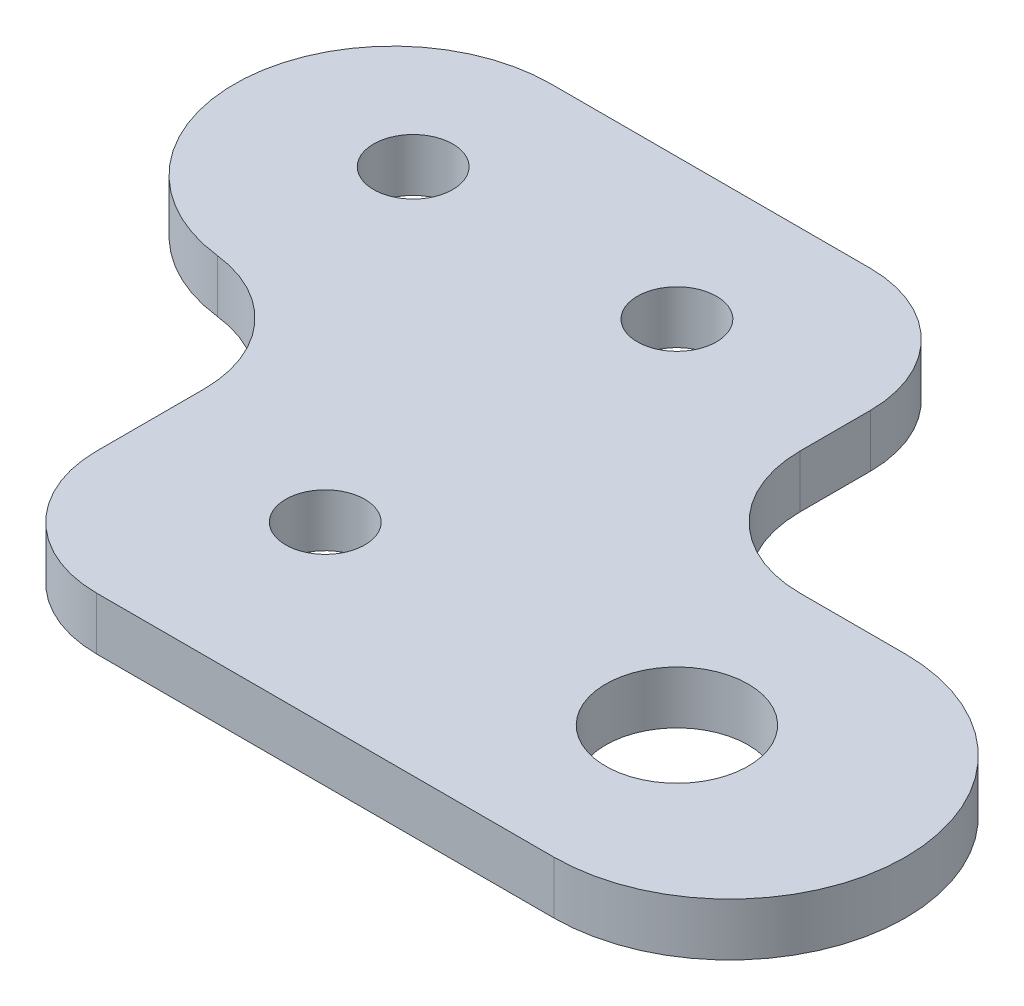
ISO-10303-21;
HEADER;
FILE_DESCRIPTION(('STEP AP214'),'2;1');
FILE_NAME('part.step','',(''),(''),'','','');
FILE_SCHEMA(('AUTOMOTIVE_DESIGN { 1 0 10303 214 1 1 1 1 }'));
ENDSEC;
DATA;
#1=APPLICATION_CONTEXT('core data for automotive mechanical design processes');
#2=APPLICATION_PROTOCOL_DEFINITION('international standard','automotive_design',2000,#1);
#3=PRODUCT_CONTEXT('',#1,'mechanical');
#4=PRODUCT('Part','Part','',(#3));
#5=PRODUCT_RELATED_PRODUCT_CATEGORY('part','',(#4));
#6=PRODUCT_DEFINITION_FORMATION('','',#4);
#7=PRODUCT_DEFINITION_CONTEXT('part definition',#1,'design');
#8=PRODUCT_DEFINITION('design','',#6,#7);
#9=PRODUCT_DEFINITION_SHAPE('','',#8);
#10=(LENGTH_UNIT() NAMED_UNIT(*) SI_UNIT(.MILLI.,.METRE.));
#11=(NAMED_UNIT(*) PLANE_ANGLE_UNIT() SI_UNIT($,.RADIAN.));
#12=(NAMED_UNIT(*) SI_UNIT($,.STERADIAN.) SOLID_ANGLE_UNIT());
#13=UNCERTAINTY_MEASURE_WITH_UNIT(LENGTH_MEASURE(1.E-05),#10,'distance_accuracy_value','');
#14=(GEOMETRIC_REPRESENTATION_CONTEXT(3) GLOBAL_UNCERTAINTY_ASSIGNED_CONTEXT((#13)) GLOBAL_UNIT_ASSIGNED_CONTEXT((#10,
#11,#12)) REPRESENTATION_CONTEXT('',''));
#15=CARTESIAN_POINT('',(0.,0.,0.));
#16=DIRECTION('',(0.,0.,1.));
#17=DIRECTION('',(1.,0.,0.));
#18=AXIS2_PLACEMENT_3D('',#15,#16,#17);
#19=CARTESIAN_POINT('',(-19.1599999999973,-4.500057886007,-6.00000000000227));
#20=DIRECTION('',(0.,1.,0.));
#21=DIRECTION('',(0.,0.,1.));
#22=AXIS2_PLACEMENT_3D('',#19,#20,#21);
#23=CYLINDRICAL_SURFACE('',#22,9.0000000000001);
#24=CARTESIAN_POINT('',(-19.1599999999973,-1.500057886007,-6.00000000000227));
#25=DIRECTION('',(0.,1.,0.));
#26=DIRECTION('',(0.,0.,1.));
#27=AXIS2_PLACEMENT_3D('',#24,#25,#26);
#28=CIRCLE('',#27,9.0000000000001);
#29=CARTESIAN_POINT('',(-19.1599999999973,-1.500057886007,-15.0000000000024));
#30=VERTEX_POINT('',#29);
#31=CARTESIAN_POINT('',(-20.1949999999973,-1.500057886007,2.9402894248431));
#32=VERTEX_POINT('',#31);
#33=EDGE_CURVE('E149',#30,#32,#28,.T.);
#34=ORIENTED_EDGE('',*,*,#33,.F.);
#35=DIRECTION('',(0.,1.,0.));
#36=VECTOR('',#35,1.);
#37=CARTESIAN_POINT('',(-19.1599999999973,-4.500057886007,-15.0000000000024));
#38=LINE('',#37,#36);
#39=CARTESIAN_POINT('',(-19.1599999999973,-4.500057886007,-15.0000000000024));
#40=VERTEX_POINT('',#39);
#41=EDGE_CURVE('E11',#40,#30,#38,.T.);
#42=ORIENTED_EDGE('',*,*,#41,.F.);
#43=CARTESIAN_POINT('',(-19.1599999999973,-4.500057886007,-6.00000000000227));
#44=DIRECTION('',(0.,1.,0.));
#45=DIRECTION('',(0.,0.,1.));
#46=AXIS2_PLACEMENT_3D('',#43,#44,#45);
#47=CIRCLE('',#46,9.0000000000001);
#48=CARTESIAN_POINT('',(-20.1949999999973,-4.500057886007,2.9402894248431));
#49=VERTEX_POINT('',#48);
#50=EDGE_CURVE('E179',#40,#49,#47,.T.);
#51=ORIENTED_EDGE('',*,*,#50,.T.);
#52=DIRECTION('',(0.,1.,0.));
#53=VECTOR('',#52,1.);
#54=CARTESIAN_POINT('',(-20.1949999999973,-4.500057886007,2.9402894248431));
#55=LINE('',#54,#53);
#56=EDGE_CURVE('E37',#49,#32,#55,.T.);
#57=ORIENTED_EDGE('',*,*,#56,.T.);
#58=EDGE_LOOP('',(#34,#42,#51,#57));
#59=FACE_BOUND('',#58,.T.);
#60=ADVANCED_FACE('F34',(#59),#23,.T.);
#61=CARTESIAN_POINT('',(-0.999999999992344,-4.500057886007,-15.0000000000024));
#62=DIRECTION('',(0.,0.,-1.));
#63=DIRECTION('',(-1.,0.,0.));
#64=AXIS2_PLACEMENT_3D('',#61,#62,#63);
#65=PLANE('',#64);
#66=DIRECTION('',(-1.,0.,0.));
#67=VECTOR('',#66,1.);
#68=CARTESIAN_POINT('',(-0.999999999992344,-1.500057886007,-15.0000000000024));
#69=LINE('',#68,#67);
#70=CARTESIAN_POINT('',(-0.999999999992343,-1.500057886007,-15.0000000000024));
#71=VERTEX_POINT('',#70);
#72=EDGE_CURVE('E177',#71,#30,#69,.T.);
#73=ORIENTED_EDGE('',*,*,#72,.F.);
#74=DIRECTION('',(0.,1.,0.));
#75=VECTOR('',#74,1.);
#76=CARTESIAN_POINT('',(-0.999999999992343,-4.500057886007,-15.0000000000024));
#77=LINE('',#76,#75);
#78=CARTESIAN_POINT('',(-0.999999999992343,-4.500057886007,-15.0000000000024));
#79=VERTEX_POINT('',#78);
#80=EDGE_CURVE('E43',#79,#71,#77,.T.);
#81=ORIENTED_EDGE('',*,*,#80,.F.);
#82=DIRECTION('',(-1.,0.,0.));
#83=VECTOR('',#82,1.);
#84=CARTESIAN_POINT('',(-0.999999999992344,-4.500057886007,-15.0000000000024));
#85=LINE('',#84,#83);
#86=EDGE_CURVE('E139',#79,#40,#85,.T.);
#87=ORIENTED_EDGE('',*,*,#86,.T.);
#88=ORIENTED_EDGE('',*,*,#41,.T.);
#89=EDGE_LOOP('',(#73,#81,#87,#88));
#90=FACE_BOUND('',#89,.T.);
#91=ADVANCED_FACE('F197',(#90),#65,.T.);
#92=CARTESIAN_POINT('',(-0.999999999992344,-4.500057886007,-8.00000000000238));
#93=DIRECTION('',(0.,1.,0.));
#94=DIRECTION('',(0.,0.,1.));
#95=AXIS2_PLACEMENT_3D('',#92,#93,#94);
#96=CYLINDRICAL_SURFACE('',#95,7.);
#97=CARTESIAN_POINT('',(-0.999999999992344,-1.500057886007,-8.00000000000238));
#98=DIRECTION('',(0.,1.,0.));
#99=DIRECTION('',(0.,0.,1.));
#100=AXIS2_PLACEMENT_3D('',#97,#98,#99);
#101=CIRCLE('',#100,7.);
#102=CARTESIAN_POINT('',(6.00000000000766,-1.500057886007,-8.00000000000238));
#103=VERTEX_POINT('',#102);
#104=EDGE_CURVE('E126',#103,#71,#101,.T.);
#105=ORIENTED_EDGE('',*,*,#104,.F.);
#106=DIRECTION('',(0.,1.,0.));
#107=VECTOR('',#106,1.);
#108=CARTESIAN_POINT('',(6.00000000000766,-4.500057886007,-8.00000000000238));
#109=LINE('',#108,#107);
#110=CARTESIAN_POINT('',(6.00000000000766,-4.500057886007,-8.00000000000238));
#111=VERTEX_POINT('',#110);
#112=EDGE_CURVE('E121',#111,#103,#109,.T.);
#113=ORIENTED_EDGE('',*,*,#112,.F.);
#114=CARTESIAN_POINT('',(-0.999999999992344,-4.500057886007,-8.00000000000238));
#115=DIRECTION('',(0.,1.,0.));
#116=DIRECTION('',(0.,0.,1.));
#117=AXIS2_PLACEMENT_3D('',#114,#115,#116);
#118=CIRCLE('',#117,7.);
#119=EDGE_CURVE('E124',#111,#79,#118,.T.);
#120=ORIENTED_EDGE('',*,*,#119,.T.);
#121=ORIENTED_EDGE('',*,*,#80,.T.);
#122=EDGE_LOOP('',(#105,#113,#120,#121));
#123=FACE_BOUND('',#122,.T.);
#124=ADVANCED_FACE('F123',(#123),#96,.T.);
#125=CARTESIAN_POINT('',(6.00000000000766,-4.500057886007,-4.00000000000238));
#126=DIRECTION('',(1.,0.,0.));
#127=DIRECTION('',(0.,0.,-1.));
#128=AXIS2_PLACEMENT_3D('',#125,#126,#127);
#129=PLANE('',#128);
#130=DIRECTION('',(0.,0.,-1.));
#131=VECTOR('',#130,1.);
#132=CARTESIAN_POINT('',(6.00000000000766,-1.500057886007,-4.00000000000238));
#133=LINE('',#132,#131);
#134=CARTESIAN_POINT('',(6.00000000000766,-1.500057886007,-4.00000000000238));
#135=VERTEX_POINT('',#134);
#136=EDGE_CURVE('E174',#135,#103,#133,.T.);
#137=ORIENTED_EDGE('',*,*,#136,.F.);
#138=DIRECTION('',(0.,1.,0.));
#139=VECTOR('',#138,1.);
#140=CARTESIAN_POINT('',(6.00000000000766,-4.500057886007,-4.00000000000238));
#141=LINE('',#140,#139);
#142=CARTESIAN_POINT('',(6.00000000000766,-4.500057886007,-4.00000000000238));
#143=VERTEX_POINT('',#142);
#144=EDGE_CURVE('E131',#143,#135,#141,.T.);
#145=ORIENTED_EDGE('',*,*,#144,.F.);
#146=DIRECTION('',(0.,0.,-1.));
#147=VECTOR('',#146,1.);
#148=CARTESIAN_POINT('',(6.00000000000766,-4.500057886007,-4.00000000000238));
#149=LINE('',#148,#147);
#150=EDGE_CURVE('E137',#143,#111,#149,.T.);
#151=ORIENTED_EDGE('',*,*,#150,.T.);
#152=ORIENTED_EDGE('',*,*,#112,.T.);
#153=EDGE_LOOP('',(#137,#145,#151,#152));
#154=FACE_BOUND('',#153,.T.);
#155=ADVANCED_FACE('F141',(#154),#129,.T.);
#156=CARTESIAN_POINT('',(13.0000000000102,-4.500057886007,-4.00000000000238));
#157=DIRECTION('',(0.,1.,0.));
#158=DIRECTION('',(0.,0.,1.));
#159=AXIS2_PLACEMENT_3D('',#156,#157,#158);
#160=CYLINDRICAL_SURFACE('',#159,7.0000000000025);
#161=CARTESIAN_POINT('',(13.0000000000102,-1.500057886007,-4.00000000000238));
#162=DIRECTION('',(0.,-1.,0.));
#163=DIRECTION('',(0.,0.,-1.));
#164=AXIS2_PLACEMENT_3D('',#161,#162,#163);
#165=CIRCLE('',#164,7.0000000000025);
#166=CARTESIAN_POINT('',(13.0000000000102,-1.500057886007,3.00000000000012));
#167=VERTEX_POINT('',#166);
#168=EDGE_CURVE('E171',#167,#135,#165,.T.);
#169=ORIENTED_EDGE('',*,*,#168,.F.);
#170=DIRECTION('',(0.,1.,0.));
#171=VECTOR('',#170,1.);
#172=CARTESIAN_POINT('',(13.0000000000102,-4.500057886007,3.00000000000012));
#173=LINE('',#172,#171);
#174=CARTESIAN_POINT('',(13.0000000000102,-4.500057886007,3.00000000000012));
#175=VERTEX_POINT('',#174);
#176=EDGE_CURVE('E183',#175,#167,#173,.T.);
#177=ORIENTED_EDGE('',*,*,#176,.F.);
#178=CARTESIAN_POINT('',(13.0000000000102,-4.500057886007,-4.00000000000238));
#179=DIRECTION('',(0.,-1.,0.));
#180=DIRECTION('',(0.,0.,-1.));
#181=AXIS2_PLACEMENT_3D('',#178,#179,#180);
#182=CIRCLE('',#181,7.0000000000025);
#183=EDGE_CURVE('E142',#175,#143,#182,.T.);
#184=ORIENTED_EDGE('',*,*,#183,.T.);
#185=ORIENTED_EDGE('',*,*,#144,.T.);
#186=EDGE_LOOP('',(#169,#177,#184,#185));
#187=FACE_BOUND('',#186,.T.);
#188=ADVANCED_FACE('F210',(#187),#160,.F.);
#189=CARTESIAN_POINT('',(18.9999999999975,-4.500057886007,3.00000000000012));
#190=DIRECTION('',(0.,0.,-1.));
#191=DIRECTION('',(-1.,0.,0.));
#192=AXIS2_PLACEMENT_3D('',#189,#190,#191);
#193=PLANE('',#192);
#194=DIRECTION('',(-1.,0.,0.));
#195=VECTOR('',#194,1.);
#196=CARTESIAN_POINT('',(18.9999999999975,-1.500057886007,3.00000000000012));
#197=LINE('',#196,#195);
#198=CARTESIAN_POINT('',(18.9999999999975,-1.500057886007,3.00000000000012));
#199=VERTEX_POINT('',#198);
#200=EDGE_CURVE('E168',#199,#167,#197,.T.);
#201=ORIENTED_EDGE('',*,*,#200,.F.);
#202=DIRECTION('',(0.,1.,0.));
#203=VECTOR('',#202,1.);
#204=CARTESIAN_POINT('',(18.9999999999975,-4.500057886007,3.00000000000012));
#205=LINE('',#204,#203);
#206=CARTESIAN_POINT('',(18.9999999999975,-4.500057886007,3.00000000000012));
#207=VERTEX_POINT('',#206);
#208=EDGE_CURVE('E185',#207,#199,#205,.T.);
#209=ORIENTED_EDGE('',*,*,#208,.F.);
#210=DIRECTION('',(-1.,0.,0.));
#211=VECTOR('',#210,1.);
#212=CARTESIAN_POINT('',(18.9999999999975,-4.500057886007,3.00000000000012));
#213=LINE('',#212,#211);
#214=EDGE_CURVE('E144',#207,#175,#213,.T.);
#215=ORIENTED_EDGE('',*,*,#214,.T.);
#216=ORIENTED_EDGE('',*,*,#176,.T.);
#217=EDGE_LOOP('',(#201,#209,#215,#216));
#218=FACE_BOUND('',#217,.T.);
#219=ADVANCED_FACE('F213',(#218),#193,.T.);
#220=CARTESIAN_POINT('',(18.9999999999975,-4.500057886007,12.9999999999988));
#221=DIRECTION('',(0.,1.,0.));
#222=DIRECTION('',(0.,0.,1.));
#223=AXIS2_PLACEMENT_3D('',#220,#221,#222);
#224=CYLINDRICAL_SURFACE('',#223,9.99999999999869);
#225=CARTESIAN_POINT('',(18.9999999999975,-1.500057886007,12.9999999999988));
#226=DIRECTION('',(0.,1.,0.));
#227=DIRECTION('',(0.,0.,1.));
#228=AXIS2_PLACEMENT_3D('',#225,#226,#227);
#229=CIRCLE('',#228,9.99999999999869);
#230=CARTESIAN_POINT('',(18.9999999999975,-1.500057886007,22.9999999999975));
#231=VERTEX_POINT('',#230);
#232=EDGE_CURVE('E165',#231,#199,#229,.T.);
#233=ORIENTED_EDGE('',*,*,#232,.F.);
#234=DIRECTION('',(0.,1.,0.));
#235=VECTOR('',#234,1.);
#236=CARTESIAN_POINT('',(18.9999999999975,-4.500057886007,22.9999999999975));
#237=LINE('',#236,#235);
#238=CARTESIAN_POINT('',(18.9999999999975,-4.500057886007,22.9999999999975));
#239=VERTEX_POINT('',#238);
#240=EDGE_CURVE('E187',#239,#231,#237,.T.);
#241=ORIENTED_EDGE('',*,*,#240,.F.);
#242=CARTESIAN_POINT('',(18.9999999999975,-4.500057886007,12.9999999999988));
#243=DIRECTION('',(0.,1.,0.));
#244=DIRECTION('',(0.,0.,1.));
#245=AXIS2_PLACEMENT_3D('',#242,#243,#244);
#246=CIRCLE('',#245,9.99999999999869);
#247=EDGE_CURVE('E300',#239,#207,#246,.T.);
#248=ORIENTED_EDGE('',*,*,#247,.T.);
#249=ORIENTED_EDGE('',*,*,#208,.T.);
#250=EDGE_LOOP('',(#233,#241,#248,#249));
#251=FACE_BOUND('',#250,.T.);
#252=ADVANCED_FACE('F217',(#251),#224,.T.);
#253=CARTESIAN_POINT('',(-6.9999999999975,-4.500057886007,22.9999999999975));
#254=DIRECTION('',(0.,0.,1.));
#255=DIRECTION('',(1.,0.,0.));
#256=AXIS2_PLACEMENT_3D('',#253,#254,#255);
#257=PLANE('',#256);
#258=DIRECTION('',(1.,0.,0.));
#259=VECTOR('',#258,1.);
#260=CARTESIAN_POINT('',(-6.9999999999975,-1.500057886007,22.9999999999975));
#261=LINE('',#260,#259);
#262=CARTESIAN_POINT('',(-6.9999999999975,-1.500057886007,22.9999999999975));
#263=VERTEX_POINT('',#262);
#264=EDGE_CURVE('E162',#263,#231,#261,.T.);
#265=ORIENTED_EDGE('',*,*,#264,.F.);
#266=DIRECTION('',(0.,1.,0.));
#267=VECTOR('',#266,1.);
#268=CARTESIAN_POINT('',(-6.9999999999975,-4.500057886007,22.9999999999975));
#269=LINE('',#268,#267);
#270=CARTESIAN_POINT('',(-6.9999999999975,-4.500057886007,22.9999999999975));
#271=VERTEX_POINT('',#270);
#272=EDGE_CURVE('E189',#271,#263,#269,.T.);
#273=ORIENTED_EDGE('',*,*,#272,.F.);
#274=DIRECTION('',(1.,0.,0.));
#275=VECTOR('',#274,1.);
#276=CARTESIAN_POINT('',(-6.9999999999975,-4.500057886007,22.9999999999975));
#277=LINE('',#276,#275);
#278=EDGE_CURVE('E297',#271,#239,#277,.T.);
#279=ORIENTED_EDGE('',*,*,#278,.T.);
#280=ORIENTED_EDGE('',*,*,#240,.T.);
#281=EDGE_LOOP('',(#265,#273,#279,#280));
#282=FACE_BOUND('',#281,.T.);
#283=ADVANCED_FACE('F221',(#282),#257,.T.);
#284=CARTESIAN_POINT('',(-6.9999999999975,-4.500057886007,16.));
#285=DIRECTION('',(0.,1.,0.));
#286=DIRECTION('',(0.,0.,1.));
#287=AXIS2_PLACEMENT_3D('',#284,#285,#286);
#288=CYLINDRICAL_SURFACE('',#287,6.9999999999975);
#289=CARTESIAN_POINT('',(-6.9999999999975,-1.500057886007,16.));
#290=DIRECTION('',(0.,1.,0.));
#291=DIRECTION('',(0.,0.,1.));
#292=AXIS2_PLACEMENT_3D('',#289,#290,#291);
#293=CIRCLE('',#292,6.9999999999975);
#294=CARTESIAN_POINT('',(-13.999999999995,-1.500057886007,16.));
#295=VERTEX_POINT('',#294);
#296=EDGE_CURVE('E159',#295,#263,#293,.T.);
#297=ORIENTED_EDGE('',*,*,#296,.F.);
#298=DIRECTION('',(0.,1.,0.));
#299=VECTOR('',#298,1.);
#300=CARTESIAN_POINT('',(-13.999999999995,-4.500057886007,16.));
#301=LINE('',#300,#299);
#302=CARTESIAN_POINT('',(-13.999999999995,-4.500057886007,16.));
#303=VERTEX_POINT('',#302);
#304=EDGE_CURVE('E191',#303,#295,#301,.T.);
#305=ORIENTED_EDGE('',*,*,#304,.F.);
#306=CARTESIAN_POINT('',(-6.9999999999975,-4.500057886007,16.));
#307=DIRECTION('',(0.,1.,0.));
#308=DIRECTION('',(0.,0.,1.));
#309=AXIS2_PLACEMENT_3D('',#306,#307,#308);
#310=CIRCLE('',#309,6.9999999999975);
#311=EDGE_CURVE('E294',#303,#271,#310,.T.);
#312=ORIENTED_EDGE('',*,*,#311,.T.);
#313=ORIENTED_EDGE('',*,*,#272,.T.);
#314=EDGE_LOOP('',(#297,#305,#312,#313));
#315=FACE_BOUND('',#314,.T.);
#316=ADVANCED_FACE('F225',(#315),#288,.T.);
#317=CARTESIAN_POINT('',(-13.999999999995,-4.500057886007,9.893847866392));
#318=DIRECTION('',(-1.,0.,0.));
#319=DIRECTION('',(0.,0.,1.));
#320=AXIS2_PLACEMENT_3D('',#317,#318,#319);
#321=PLANE('',#320);
#322=DIRECTION('',(0.,0.,1.));
#323=VECTOR('',#322,1.);
#324=CARTESIAN_POINT('',(-13.999999999995,-1.500057886007,9.893847866392));
#325=LINE('',#324,#323);
#326=CARTESIAN_POINT('',(-13.999999999995,-1.500057886007,9.893847866392));
#327=VERTEX_POINT('',#326);
#328=EDGE_CURVE('E156',#327,#295,#325,.T.);
#329=ORIENTED_EDGE('',*,*,#328,.F.);
#330=DIRECTION('',(0.,1.,0.));
#331=VECTOR('',#330,1.);
#332=CARTESIAN_POINT('',(-13.999999999995,-4.500057886007,9.893847866392));
#333=LINE('',#332,#331);
#334=CARTESIAN_POINT('',(-13.999999999995,-4.500057886007,9.893847866392));
#335=VERTEX_POINT('',#334);
#336=EDGE_CURVE('E192',#335,#327,#333,.T.);
#337=ORIENTED_EDGE('',*,*,#336,.F.);
#338=DIRECTION('',(0.,0.,1.));
#339=VECTOR('',#338,1.);
#340=CARTESIAN_POINT('',(-13.999999999995,-4.500057886007,9.893847866392));
#341=LINE('',#340,#339);
#342=EDGE_CURVE('E291',#335,#303,#341,.T.);
#343=ORIENTED_EDGE('',*,*,#342,.T.);
#344=ORIENTED_EDGE('',*,*,#304,.T.);
#345=EDGE_LOOP('',(#329,#337,#343,#344));
#346=FACE_BOUND('',#345,.T.);
#347=ADVANCED_FACE('F229',(#346),#321,.T.);
#348=CARTESIAN_POINT('',(-20.9999999999976,-4.500057886007,9.893847866392));
#349=DIRECTION('',(0.,1.,0.));
#350=DIRECTION('',(0.,0.,1.));
#351=AXIS2_PLACEMENT_3D('',#348,#349,#350);
#352=CYLINDRICAL_SURFACE('',#351,7.00000000000261);
#353=CARTESIAN_POINT('',(-20.9999999999976,-1.500057886007,9.893847866392));
#354=DIRECTION('',(0.,-1.,0.));
#355=DIRECTION('',(0.,0.,-1.));
#356=AXIS2_PLACEMENT_3D('',#353,#354,#355);
#357=CIRCLE('',#356,7.00000000000261);
#358=EDGE_CURVE('E152',#32,#327,#357,.T.);
#359=ORIENTED_EDGE('',*,*,#358,.F.);
#360=ORIENTED_EDGE('',*,*,#56,.F.);
#361=CARTESIAN_POINT('',(-20.9999999999976,-4.500057886007,9.893847866392));
#362=DIRECTION('',(0.,-1.,0.));
#363=DIRECTION('',(0.,0.,-1.));
#364=AXIS2_PLACEMENT_3D('',#361,#362,#363);
#365=CIRCLE('',#364,7.00000000000261);
#366=EDGE_CURVE('E289',#49,#335,#365,.T.);
#367=ORIENTED_EDGE('',*,*,#366,.T.);
#368=ORIENTED_EDGE('',*,*,#336,.T.);
#369=EDGE_LOOP('',(#359,#360,#367,#368));
#370=FACE_BOUND('',#369,.T.);
#371=ADVANCED_FACE('F194',(#370),#352,.F.);
#372=CARTESIAN_POINT('',(-19.1599999999973,-4.500057886007,-6.00000000000227));
#373=DIRECTION('',(0.,1.,0.));
#374=DIRECTION('',(0.,0.,1.));
#375=AXIS2_PLACEMENT_3D('',#372,#373,#374);
#376=PLANE('',#375);
#377=CARTESIAN_POINT('',(-3.999999999995,-4.500057886007,-7.));
#378=DIRECTION('',(0.,1.,0.));
#379=DIRECTION('',(0.,0.,-1.));
#380=AXIS2_PLACEMENT_3D('',#377,#378,#379);
#381=CIRCLE('',#380,2.25);
#382=CARTESIAN_POINT('',(-3.999999999995,-4.500057886007,-9.25));
#383=VERTEX_POINT('',#382);
#384=EDGE_CURVE('E264',#383,#383,#381,.T.);
#385=ORIENTED_EDGE('',*,*,#384,.T.);
#386=EDGE_LOOP('',(#385));
#387=FACE_BOUND('',#386,.T.);
#388=CARTESIAN_POINT('',(-3.999999999995,-4.500057886007,13.));
#389=DIRECTION('',(0.,1.,0.));
#390=DIRECTION('',(0.,0.,-1.));
#391=AXIS2_PLACEMENT_3D('',#388,#389,#390);
#392=CIRCLE('',#391,2.25);
#393=CARTESIAN_POINT('',(-3.999999999995,-4.500057886007,10.75));
#394=VERTEX_POINT('',#393);
#395=EDGE_CURVE('E272',#394,#394,#392,.T.);
#396=ORIENTED_EDGE('',*,*,#395,.T.);
#397=EDGE_LOOP('',(#396));
#398=FACE_BOUND('',#397,.T.);
#399=CARTESIAN_POINT('',(-19.,-4.500057886007,-7.));
#400=DIRECTION('',(0.,1.,0.));
#401=DIRECTION('',(0.,0.,-1.));
#402=AXIS2_PLACEMENT_3D('',#399,#400,#401);
#403=CIRCLE('',#402,2.25);
#404=CARTESIAN_POINT('',(-19.,-4.500057886007,-9.25));
#405=VERTEX_POINT('',#404);
#406=EDGE_CURVE('E278',#405,#405,#403,.T.);
#407=ORIENTED_EDGE('',*,*,#406,.T.);
#408=EDGE_LOOP('',(#407));
#409=FACE_BOUND('',#408,.T.);
#410=CARTESIAN_POINT('',(16.,-4.500057886007,13.));
#411=DIRECTION('',(0.,1.,0.));
#412=DIRECTION('',(0.,0.,-1.));
#413=AXIS2_PLACEMENT_3D('',#410,#411,#412);
#414=CIRCLE('',#413,4.05);
#415=CARTESIAN_POINT('',(16.,-4.500057886007,8.95));
#416=VERTEX_POINT('',#415);
#417=EDGE_CURVE('E153',#416,#416,#414,.T.);
#418=ORIENTED_EDGE('',*,*,#417,.T.);
#419=EDGE_LOOP('',(#418));
#420=FACE_BOUND('',#419,.T.);
#421=ORIENTED_EDGE('',*,*,#50,.F.);
#422=ORIENTED_EDGE('',*,*,#86,.F.);
#423=ORIENTED_EDGE('',*,*,#119,.F.);
#424=ORIENTED_EDGE('',*,*,#150,.F.);
#425=ORIENTED_EDGE('',*,*,#183,.F.);
#426=ORIENTED_EDGE('',*,*,#214,.F.);
#427=ORIENTED_EDGE('',*,*,#247,.F.);
#428=ORIENTED_EDGE('',*,*,#278,.F.);
#429=ORIENTED_EDGE('',*,*,#311,.F.);
#430=ORIENTED_EDGE('',*,*,#342,.F.);
#431=ORIENTED_EDGE('',*,*,#366,.F.);
#432=EDGE_LOOP('',(#421,#422,#423,#424,#425,#426,#427,#428,#429,#430,#431));
#433=FACE_BOUND('',#432,.T.);
#434=ADVANCED_FACE('F135',(#387,#398,#409,#420,#433),#376,.F.);
#435=CARTESIAN_POINT('',(-19.1599999999973,-1.500057886007,-6.00000000000227));
#436=DIRECTION('',(0.,1.,0.));
#437=DIRECTION('',(0.,0.,1.));
#438=AXIS2_PLACEMENT_3D('',#435,#436,#437);
#439=PLANE('',#438);
#440=CARTESIAN_POINT('',(-3.999999999995,-1.500057886007,-7.));
#441=DIRECTION('',(0.,1.,0.));
#442=DIRECTION('',(0.,0.,-1.));
#443=AXIS2_PLACEMENT_3D('',#440,#441,#442);
#444=CIRCLE('',#443,2.25);
#445=CARTESIAN_POINT('',(-3.999999999995,-1.500057886007,-9.25));
#446=VERTEX_POINT('',#445);
#447=EDGE_CURVE('E267',#446,#446,#444,.T.);
#448=ORIENTED_EDGE('',*,*,#447,.F.);
#449=EDGE_LOOP('',(#448));
#450=FACE_BOUND('',#449,.T.);
#451=CARTESIAN_POINT('',(-3.999999999995,-1.500057886007,13.));
#452=DIRECTION('',(0.,1.,0.));
#453=DIRECTION('',(0.,0.,-1.));
#454=AXIS2_PLACEMENT_3D('',#451,#452,#453);
#455=CIRCLE('',#454,2.25);
#456=CARTESIAN_POINT('',(-3.999999999995,-1.500057886007,10.75));
#457=VERTEX_POINT('',#456);
#458=EDGE_CURVE('E269',#457,#457,#455,.T.);
#459=ORIENTED_EDGE('',*,*,#458,.F.);
#460=EDGE_LOOP('',(#459));
#461=FACE_BOUND('',#460,.T.);
#462=CARTESIAN_POINT('',(-19.,-1.500057886007,-7.));
#463=DIRECTION('',(0.,1.,0.));
#464=DIRECTION('',(0.,0.,-1.));
#465=AXIS2_PLACEMENT_3D('',#462,#463,#464);
#466=CIRCLE('',#465,2.25);
#467=CARTESIAN_POINT('',(-19.,-1.500057886007,-9.25));
#468=VERTEX_POINT('',#467);
#469=EDGE_CURVE('E275',#468,#468,#466,.T.);
#470=ORIENTED_EDGE('',*,*,#469,.F.);
#471=EDGE_LOOP('',(#470));
#472=FACE_BOUND('',#471,.T.);
#473=CARTESIAN_POINT('',(16.,-1.500057886007,13.));
#474=DIRECTION('',(0.,1.,0.));
#475=DIRECTION('',(0.,0.,-1.));
#476=AXIS2_PLACEMENT_3D('',#473,#474,#475);
#477=CIRCLE('',#476,4.05);
#478=CARTESIAN_POINT('',(16.,-1.500057886007,8.95));
#479=VERTEX_POINT('',#478);
#480=EDGE_CURVE('E281',#479,#479,#477,.T.);
#481=ORIENTED_EDGE('',*,*,#480,.F.);
#482=EDGE_LOOP('',(#481));
#483=FACE_BOUND('',#482,.T.);
#484=ORIENTED_EDGE('',*,*,#33,.T.);
#485=ORIENTED_EDGE('',*,*,#358,.T.);
#486=ORIENTED_EDGE('',*,*,#328,.T.);
#487=ORIENTED_EDGE('',*,*,#296,.T.);
#488=ORIENTED_EDGE('',*,*,#264,.T.);
#489=ORIENTED_EDGE('',*,*,#232,.T.);
#490=ORIENTED_EDGE('',*,*,#200,.T.);
#491=ORIENTED_EDGE('',*,*,#168,.T.);
#492=ORIENTED_EDGE('',*,*,#136,.T.);
#493=ORIENTED_EDGE('',*,*,#104,.T.);
#494=ORIENTED_EDGE('',*,*,#72,.T.);
#495=EDGE_LOOP('',(#484,#485,#486,#487,#488,#489,#490,#491,#492,#493,#494));
#496=FACE_BOUND('',#495,.T.);
#497=ADVANCED_FACE('F196',(#450,#461,#472,#483,#496),#439,.T.);
#498=CARTESIAN_POINT('',(16.,-4.500057886007,13.));
#499=DIRECTION('',(0.,1.,0.));
#500=DIRECTION('',(0.,0.,1.));
#501=AXIS2_PLACEMENT_3D('',#498,#499,#500);
#502=CYLINDRICAL_SURFACE('',#501,4.05);
#503=ORIENTED_EDGE('',*,*,#417,.F.);
#504=EDGE_LOOP('',(#503));
#505=FACE_BOUND('',#504,.T.);
#506=ORIENTED_EDGE('',*,*,#480,.T.);
#507=EDGE_LOOP('',(#506));
#508=FACE_BOUND('',#507,.T.);
#509=ADVANCED_FACE('F241',(#505,#508),#502,.F.);
#510=CARTESIAN_POINT('',(-19.,-4.500057886007,-7.));
#511=DIRECTION('',(0.,1.,0.));
#512=DIRECTION('',(0.,0.,1.));
#513=AXIS2_PLACEMENT_3D('',#510,#511,#512);
#514=CYLINDRICAL_SURFACE('',#513,2.25);
#515=ORIENTED_EDGE('',*,*,#406,.F.);
#516=EDGE_LOOP('',(#515));
#517=FACE_BOUND('',#516,.T.);
#518=ORIENTED_EDGE('',*,*,#469,.T.);
#519=EDGE_LOOP('',(#518));
#520=FACE_BOUND('',#519,.T.);
#521=ADVANCED_FACE('F248',(#517,#520),#514,.F.);
#522=CARTESIAN_POINT('',(-3.999999999995,-4.500057886007,13.));
#523=DIRECTION('',(0.,1.,0.));
#524=DIRECTION('',(0.,0.,1.));
#525=AXIS2_PLACEMENT_3D('',#522,#523,#524);
#526=CYLINDRICAL_SURFACE('',#525,2.25);
#527=ORIENTED_EDGE('',*,*,#395,.F.);
#528=EDGE_LOOP('',(#527));
#529=FACE_BOUND('',#528,.T.);
#530=ORIENTED_EDGE('',*,*,#458,.T.);
#531=EDGE_LOOP('',(#530));
#532=FACE_BOUND('',#531,.T.);
#533=ADVANCED_FACE('F252',(#529,#532),#526,.F.);
#534=CARTESIAN_POINT('',(-3.999999999995,-4.500057886007,-7.));
#535=DIRECTION('',(0.,1.,0.));
#536=DIRECTION('',(0.,0.,1.));
#537=AXIS2_PLACEMENT_3D('',#534,#535,#536);
#538=CYLINDRICAL_SURFACE('',#537,2.25);
#539=ORIENTED_EDGE('',*,*,#384,.F.);
#540=EDGE_LOOP('',(#539));
#541=FACE_BOUND('',#540,.T.);
#542=ORIENTED_EDGE('',*,*,#447,.T.);
#543=EDGE_LOOP('',(#542));
#544=FACE_BOUND('',#543,.T.);
#545=ADVANCED_FACE('F256',(#541,#544),#538,.F.);
#546=CLOSED_SHELL('',(#60,#91,#124,#155,#188,#219,#252,#283,#316,#347,#371,#434,#497,#509,#521,
#533,#545));
#547=MANIFOLD_SOLID_BREP('B2',#546);
#548=ADVANCED_BREP_SHAPE_REPRESENTATION('',(#18,#547),#14);
#549=SHAPE_DEFINITION_REPRESENTATION(#9,#548);
ENDSEC;
END-ISO-10303-21;
